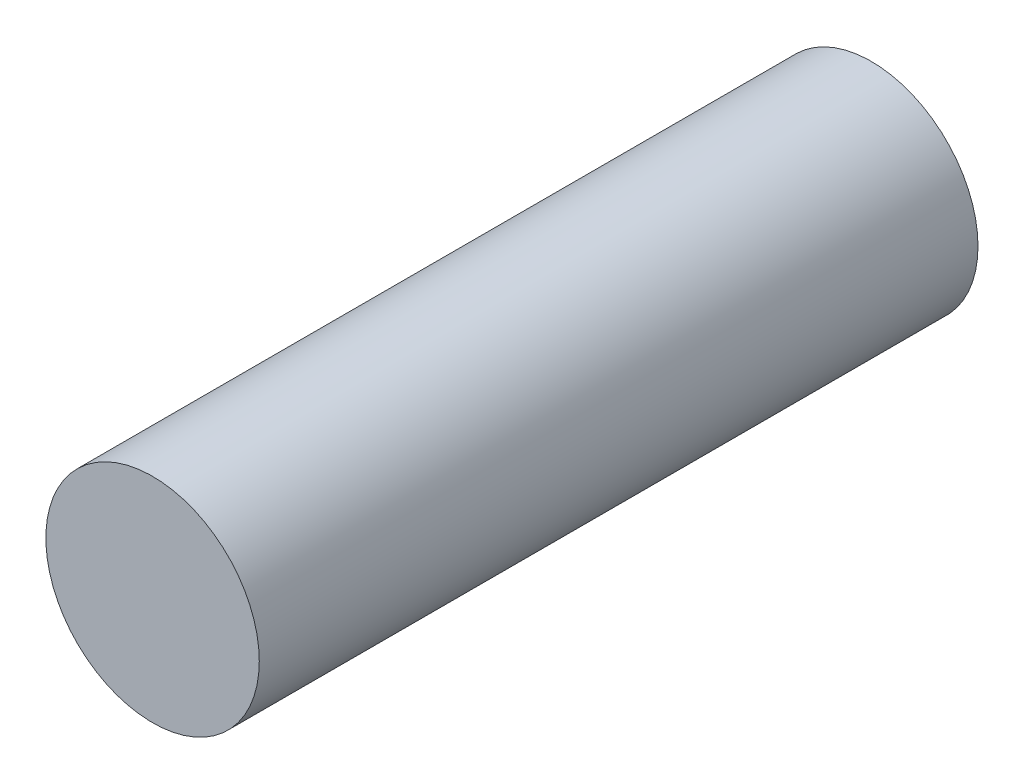
ISO-10303-21;
HEADER;
FILE_DESCRIPTION(('STEP AP214'),'2;1');
FILE_NAME('part.step','',(''),(''),'','','');
FILE_SCHEMA(('AUTOMOTIVE_DESIGN { 1 0 10303 214 1 1 1 1 }'));
ENDSEC;
DATA;
#1=APPLICATION_CONTEXT('core data for automotive mechanical design processes');
#2=APPLICATION_PROTOCOL_DEFINITION('international standard','automotive_design',2000,#1);
#3=PRODUCT_CONTEXT('',#1,'mechanical');
#4=PRODUCT('Part','Part','',(#3));
#5=PRODUCT_RELATED_PRODUCT_CATEGORY('part','',(#4));
#6=PRODUCT_DEFINITION_FORMATION('','',#4);
#7=PRODUCT_DEFINITION_CONTEXT('part definition',#1,'design');
#8=PRODUCT_DEFINITION('design','',#6,#7);
#9=PRODUCT_DEFINITION_SHAPE('','',#8);
#10=(LENGTH_UNIT() NAMED_UNIT(*) SI_UNIT(.MILLI.,.METRE.));
#11=(NAMED_UNIT(*) PLANE_ANGLE_UNIT() SI_UNIT($,.RADIAN.));
#12=(NAMED_UNIT(*) SI_UNIT($,.STERADIAN.) SOLID_ANGLE_UNIT());
#13=UNCERTAINTY_MEASURE_WITH_UNIT(LENGTH_MEASURE(1.E-05),#10,'distance_accuracy_value','');
#14=(GEOMETRIC_REPRESENTATION_CONTEXT(3) GLOBAL_UNCERTAINTY_ASSIGNED_CONTEXT((#13)) GLOBAL_UNIT_ASSIGNED_CONTEXT((#10,
#11,#12)) REPRESENTATION_CONTEXT('',''));
#15=CARTESIAN_POINT('',(0.,0.,0.));
#16=DIRECTION('',(0.,0.,1.));
#17=DIRECTION('',(1.,0.,0.));
#18=AXIS2_PLACEMENT_3D('',#15,#16,#17);
#19=CARTESIAN_POINT('',(-14.9653093240353,8.77511319454798,83.82));
#20=DIRECTION('',(0.,0.,-1.));
#21=DIRECTION('',(-1.,0.,0.));
#22=AXIS2_PLACEMENT_3D('',#19,#20,#21);
#23=CYLINDRICAL_SURFACE('',#22,12.446);
#24=CARTESIAN_POINT('',(-14.9653093240353,8.77511319454798,83.82));
#25=DIRECTION('',(0.,0.,1.));
#26=DIRECTION('',(1.,0.,0.));
#27=AXIS2_PLACEMENT_3D('',#24,#25,#26);
#28=CIRCLE('',#27,12.446);
#29=CARTESIAN_POINT('',(-2.51930932403531,8.77511319454798,83.82));
#30=VERTEX_POINT('',#29);
#31=EDGE_CURVE('E10',#30,#30,#28,.T.);
#32=ORIENTED_EDGE('',*,*,#31,.F.);
#33=EDGE_LOOP('',(#32));
#34=FACE_BOUND('',#33,.T.);
#35=CARTESIAN_POINT('',(-14.9653093240353,8.77511319454798,0.));
#36=DIRECTION('',(0.,0.,1.));
#37=DIRECTION('',(1.,0.,0.));
#38=AXIS2_PLACEMENT_3D('',#35,#36,#37);
#39=CIRCLE('',#38,12.446);
#40=CARTESIAN_POINT('',(-2.51930932403531,8.77511319454798,0.));
#41=VERTEX_POINT('',#40);
#42=EDGE_CURVE('E34',#41,#41,#39,.T.);
#43=ORIENTED_EDGE('',*,*,#42,.T.);
#44=EDGE_LOOP('',(#43));
#45=FACE_BOUND('',#44,.T.);
#46=ADVANCED_FACE('F31',(#34,#45),#23,.T.);
#47=CARTESIAN_POINT('',(-14.9653093240353,8.77511319454798,83.82));
#48=DIRECTION('',(0.,0.,1.));
#49=DIRECTION('',(1.,0.,0.));
#50=AXIS2_PLACEMENT_3D('',#47,#48,#49);
#51=PLANE('',#50);
#52=ORIENTED_EDGE('',*,*,#31,.T.);
#53=EDGE_LOOP('',(#52));
#54=FACE_BOUND('',#53,.T.);
#55=ADVANCED_FACE('F46',(#54),#51,.T.);
#56=CARTESIAN_POINT('',(-14.9653093240353,8.77511319454798,0.));
#57=DIRECTION('',(0.,0.,1.));
#58=DIRECTION('',(1.,0.,0.));
#59=AXIS2_PLACEMENT_3D('',#56,#57,#58);
#60=PLANE('',#59);
#61=ORIENTED_EDGE('',*,*,#42,.F.);
#62=EDGE_LOOP('',(#61));
#63=FACE_BOUND('',#62,.T.);
#64=ADVANCED_FACE('F44',(#63),#60,.F.);
#65=CLOSED_SHELL('',(#46,#55,#64));
#66=MANIFOLD_SOLID_BREP('B2',#65);
#67=ADVANCED_BREP_SHAPE_REPRESENTATION('',(#18,#66),#14);
#68=SHAPE_DEFINITION_REPRESENTATION(#9,#67);
ENDSEC;
END-ISO-10303-21;
